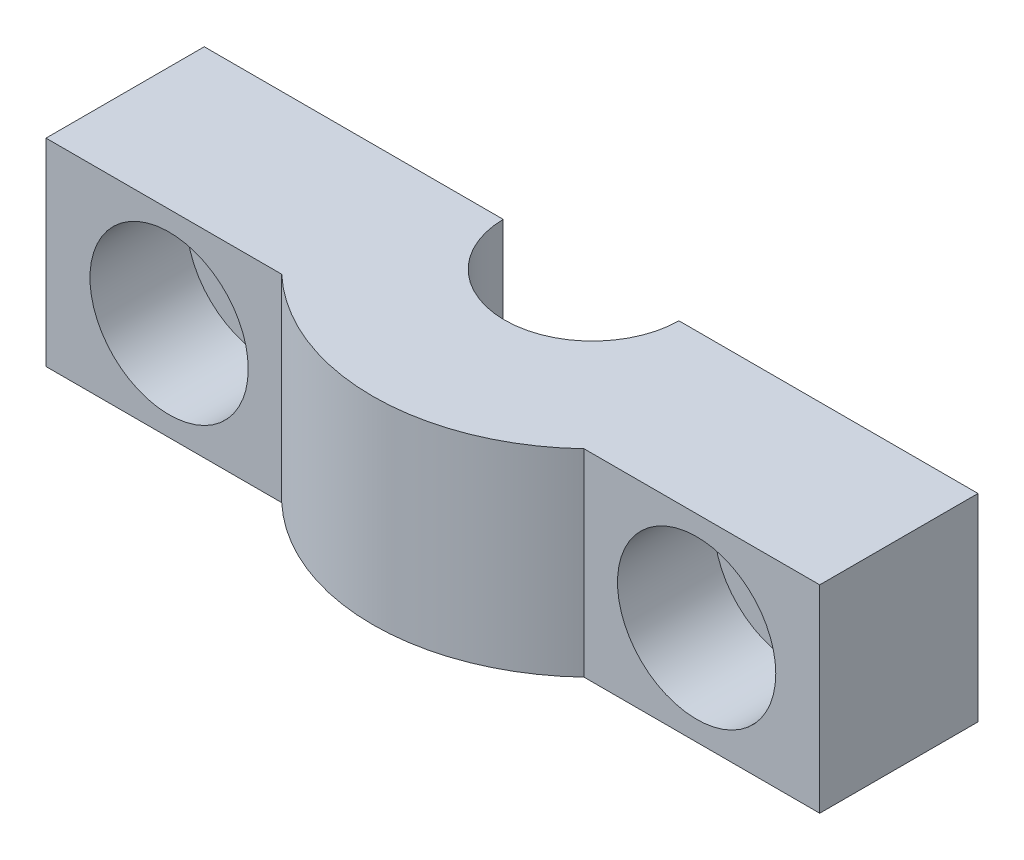
ISO-10303-21;
HEADER;
FILE_DESCRIPTION(('STEP AP214'),'2;1');
FILE_NAME('part.step','',(''),(''),'','','');
FILE_SCHEMA(('AUTOMOTIVE_DESIGN { 1 0 10303 214 1 1 1 1 }'));
ENDSEC;
DATA;
#1=APPLICATION_CONTEXT('core data for automotive mechanical design processes');
#2=APPLICATION_PROTOCOL_DEFINITION('international standard','automotive_design',2000,#1);
#3=PRODUCT_CONTEXT('',#1,'mechanical');
#4=PRODUCT('Part','Part','',(#3));
#5=PRODUCT_RELATED_PRODUCT_CATEGORY('part','',(#4));
#6=PRODUCT_DEFINITION_FORMATION('','',#4);
#7=PRODUCT_DEFINITION_CONTEXT('part definition',#1,'design');
#8=PRODUCT_DEFINITION('design','',#6,#7);
#9=PRODUCT_DEFINITION_SHAPE('','',#8);
#10=(LENGTH_UNIT() NAMED_UNIT(*) SI_UNIT(.MILLI.,.METRE.));
#11=(NAMED_UNIT(*) PLANE_ANGLE_UNIT() SI_UNIT($,.RADIAN.));
#12=(NAMED_UNIT(*) SI_UNIT($,.STERADIAN.) SOLID_ANGLE_UNIT());
#13=UNCERTAINTY_MEASURE_WITH_UNIT(LENGTH_MEASURE(1.E-05),#10,'distance_accuracy_value','');
#14=(GEOMETRIC_REPRESENTATION_CONTEXT(3) GLOBAL_UNCERTAINTY_ASSIGNED_CONTEXT((#13)) GLOBAL_UNIT_ASSIGNED_CONTEXT((#10,
#11,#12)) REPRESENTATION_CONTEXT('',''));
#15=CARTESIAN_POINT('',(0.,0.,0.));
#16=DIRECTION('',(0.,0.,1.));
#17=DIRECTION('',(1.,0.,0.));
#18=AXIS2_PLACEMENT_3D('',#15,#16,#17);
#19=CARTESIAN_POINT('',(-15.,5.625,-5.9238242869548));
#20=DIRECTION('',(0.,0.,1.));
#21=DIRECTION('',(1.,0.,0.));
#22=AXIS2_PLACEMENT_3D('',#19,#20,#21);
#23=CYLINDRICAL_SURFACE('',#22,1.75);
#24=CARTESIAN_POINT('',(-15.,5.625,0.0761757130452031));
#25=DIRECTION('',(0.,0.,1.));
#26=DIRECTION('',(1.,0.,0.));
#27=AXIS2_PLACEMENT_3D('',#24,#25,#26);
#28=CIRCLE('',#27,1.75);
#29=CARTESIAN_POINT('',(-13.25,5.625,0.0761757130452023));
#30=VERTEX_POINT('',#29);
#31=EDGE_CURVE('E161',#30,#30,#28,.T.);
#32=CARTESIAN_POINT('',(-15.,5.625,3.5761757130452));
#33=DIRECTION('',(0.,0.,1.));
#34=DIRECTION('',(1.,0.,0.));
#35=AXIS2_PLACEMENT_3D('',#32,#33,#34);
#36=CIRCLE('',#35,1.75);
#37=CARTESIAN_POINT('',(-13.25,5.625,3.5761757130452));
#38=VERTEX_POINT('',#37);
#39=EDGE_CURVE('E38',#38,#38,#36,.F.);
#40=CARTESIAN_POINT('',(-13.25,5.625,0.0761757130452023));
#41=CARTESIAN_POINT('',(-13.25,5.625,0.112634046378536));
#42=CARTESIAN_POINT('',(-13.25,5.625,0.149092379711869));
#43=CARTESIAN_POINT('',(-13.25,5.625,0.222009046378536));
#44=CARTESIAN_POINT('',(-13.25,5.625,0.258467379711869));
#45=CARTESIAN_POINT('',(-13.25,5.625,0.331384046378536));
#46=CARTESIAN_POINT('',(-13.25,5.625,0.367842379711869));
#47=CARTESIAN_POINT('',(-13.25,5.625,0.440759046378536));
#48=CARTESIAN_POINT('',(-13.25,5.625,0.477217379711869));
#49=CARTESIAN_POINT('',(-13.25,5.625,0.550134046378536));
#50=CARTESIAN_POINT('',(-13.25,5.625,0.586592379711869));
#51=CARTESIAN_POINT('',(-13.25,5.625,0.659509046378536));
#52=CARTESIAN_POINT('',(-13.25,5.625,0.69596737971187));
#53=CARTESIAN_POINT('',(-13.25,5.625,0.768884046378536));
#54=CARTESIAN_POINT('',(-13.25,5.625,0.80534237971187));
#55=CARTESIAN_POINT('',(-13.25,5.625,0.878259046378536));
#56=CARTESIAN_POINT('',(-13.25,5.625,0.91471737971187));
#57=CARTESIAN_POINT('',(-13.25,5.625,0.987634046378536));
#58=CARTESIAN_POINT('',(-13.25,5.625,1.02409237971187));
#59=CARTESIAN_POINT('',(-13.25,5.625,1.09700904637854));
#60=CARTESIAN_POINT('',(-13.25,5.625,1.13346737971187));
#61=CARTESIAN_POINT('',(-13.25,5.625,1.20638404637854));
#62=CARTESIAN_POINT('',(-13.25,5.625,1.24284237971187));
#63=CARTESIAN_POINT('',(-13.25,5.625,1.31575904637854));
#64=CARTESIAN_POINT('',(-13.25,5.625,1.35221737971187));
#65=CARTESIAN_POINT('',(-13.25,5.625,1.42513404637854));
#66=CARTESIAN_POINT('',(-13.25,5.625,1.46159237971187));
#67=CARTESIAN_POINT('',(-13.25,5.625,1.53450904637854));
#68=CARTESIAN_POINT('',(-13.25,5.625,1.57096737971187));
#69=CARTESIAN_POINT('',(-13.25,5.625,1.64388404637854));
#70=CARTESIAN_POINT('',(-13.25,5.625,1.68034237971187));
#71=CARTESIAN_POINT('',(-13.25,5.625,1.75325904637854));
#72=CARTESIAN_POINT('',(-13.25,5.625,1.78971737971187));
#73=CARTESIAN_POINT('',(-13.25,5.625,1.86263404637854));
#74=CARTESIAN_POINT('',(-13.25,5.625,1.89909237971187));
#75=CARTESIAN_POINT('',(-13.25,5.625,1.97200904637854));
#76=CARTESIAN_POINT('',(-13.25,5.625,2.00846737971187));
#77=CARTESIAN_POINT('',(-13.25,5.625,2.08138404637854));
#78=CARTESIAN_POINT('',(-13.25,5.625,2.11784237971187));
#79=CARTESIAN_POINT('',(-13.25,5.625,2.19075904637854));
#80=CARTESIAN_POINT('',(-13.25,5.625,2.22721737971187));
#81=CARTESIAN_POINT('',(-13.25,5.625,2.30013404637854));
#82=CARTESIAN_POINT('',(-13.25,5.625,2.33659237971187));
#83=CARTESIAN_POINT('',(-13.25,5.625,2.40950904637854));
#84=CARTESIAN_POINT('',(-13.25,5.625,2.44596737971187));
#85=CARTESIAN_POINT('',(-13.25,5.625,2.51888404637854));
#86=CARTESIAN_POINT('',(-13.25,5.625,2.55534237971187));
#87=CARTESIAN_POINT('',(-13.25,5.625,2.62825904637854));
#88=CARTESIAN_POINT('',(-13.25,5.625,2.66471737971187));
#89=CARTESIAN_POINT('',(-13.25,5.625,2.73763404637854));
#90=CARTESIAN_POINT('',(-13.25,5.625,2.77409237971187));
#91=CARTESIAN_POINT('',(-13.25,5.625,2.84700904637854));
#92=CARTESIAN_POINT('',(-13.25,5.625,2.88346737971187));
#93=CARTESIAN_POINT('',(-13.25,5.625,2.95638404637854));
#94=CARTESIAN_POINT('',(-13.25,5.625,2.99284237971187));
#95=CARTESIAN_POINT('',(-13.25,5.625,3.06575904637854));
#96=CARTESIAN_POINT('',(-13.25,5.625,3.10221737971187));
#97=CARTESIAN_POINT('',(-13.25,5.625,3.17513404637854));
#98=CARTESIAN_POINT('',(-13.25,5.625,3.21159237971187));
#99=CARTESIAN_POINT('',(-13.25,5.625,3.28450904637854));
#100=CARTESIAN_POINT('',(-13.25,5.625,3.32096737971187));
#101=CARTESIAN_POINT('',(-13.25,5.625,3.39388404637854));
#102=CARTESIAN_POINT('',(-13.25,5.625,3.43034237971187));
#103=CARTESIAN_POINT('',(-13.25,5.625,3.50325904637854));
#104=CARTESIAN_POINT('',(-13.25,5.625,3.53971737971187));
#105=CARTESIAN_POINT('',(-13.25,5.625,3.5761757130452));
#106=B_SPLINE_CURVE_WITH_KNOTS('',3,(#40,#41,#42,#43,#44,#45,#46,#47,#48,#49,#50,#51,#52,#53,
#54,#55,#56,#57,#58,#59,#60,#61,#62,#63,#64,#65,#66,#67,#68,#69,#70,#71,#72,#73,#74,#75,#76,#77,
#78,#79,#80,#81,#82,#83,#84,#85,#86,#87,#88,#89,#90,#91,#92,#93,#94,#95,#96,#97,#98,#99,#100,
#101,#102,#103,#104,#105),.UNSPECIFIED.,.F.,.F.,(4,2,2,2,2,2,2,2,2,2,2,2,2,2,2,2,2,2,2,2,2,2,2,
2,2,2,2,2,2,2,2,2,4),(0.,0.109375,0.21875,0.328125,0.4375,0.546875,0.656250000000001,
0.765625000000001,0.875000000000001,0.984375000000001,1.09375,1.203125,1.3125,1.421875,1.53125,
1.640625,1.75,1.859375,1.96875,2.078125,2.1875,2.296875,2.40625,2.515625,2.625,2.734375,2.84375,
2.953125,3.0625,3.171875,3.28125,3.390625,3.5),.UNSPECIFIED.);
#107=EDGE_CURVE('BSEAM34',#30,#38,#106,.T.);
#108=ORIENTED_EDGE('',*,*,#31,.F.);
#109=ORIENTED_EDGE('',*,*,#39,.F.);
#110=ORIENTED_EDGE('',*,*,#107,.T.);
#111=ORIENTED_EDGE('',*,*,#107,.F.);
#112=EDGE_LOOP('',(#108,#110,#109,#111));
#113=FACE_BOUND('',#112,.T.);
#114=ADVANCED_FACE('F34',(#113),#23,.F.);
#115=CARTESIAN_POINT('',(15.,5.625,-5.9238242869548));
#116=DIRECTION('',(0.,0.,1.));
#117=DIRECTION('',(1.,0.,0.));
#118=AXIS2_PLACEMENT_3D('',#115,#116,#117);
#119=CYLINDRICAL_SURFACE('',#118,1.75);
#120=CARTESIAN_POINT('',(15.,5.625,0.0761757130452014));
#121=DIRECTION('',(0.,0.,1.));
#122=DIRECTION('',(1.,0.,0.));
#123=AXIS2_PLACEMENT_3D('',#120,#121,#122);
#124=CIRCLE('',#123,1.75);
#125=CARTESIAN_POINT('',(16.75,5.625,0.0761757130452005));
#126=VERTEX_POINT('',#125);
#127=EDGE_CURVE('E137',#126,#126,#124,.T.);
#128=CARTESIAN_POINT('',(15.,5.625,3.5761757130452));
#129=DIRECTION('',(0.,0.,1.));
#130=DIRECTION('',(1.,0.,0.));
#131=AXIS2_PLACEMENT_3D('',#128,#129,#130);
#132=CIRCLE('',#131,1.75);
#133=CARTESIAN_POINT('',(16.75,5.625,3.5761757130452));
#134=VERTEX_POINT('',#133);
#135=EDGE_CURVE('E162',#134,#134,#132,.F.);
#136=CARTESIAN_POINT('',(16.75,5.625,0.0761757130452005));
#137=CARTESIAN_POINT('',(16.75,5.625,0.112634046378534));
#138=CARTESIAN_POINT('',(16.75,5.625,0.149092379711867));
#139=CARTESIAN_POINT('',(16.75,5.625,0.222009046378534));
#140=CARTESIAN_POINT('',(16.75,5.625,0.258467379711867));
#141=CARTESIAN_POINT('',(16.75,5.625,0.331384046378534));
#142=CARTESIAN_POINT('',(16.75,5.625,0.367842379711867));
#143=CARTESIAN_POINT('',(16.75,5.625,0.440759046378534));
#144=CARTESIAN_POINT('',(16.75,5.625,0.477217379711868));
#145=CARTESIAN_POINT('',(16.75,5.625,0.550134046378534));
#146=CARTESIAN_POINT('',(16.75,5.625,0.586592379711867));
#147=CARTESIAN_POINT('',(16.75,5.625,0.659509046378533));
#148=CARTESIAN_POINT('',(16.75,5.625,0.695967379711867));
#149=CARTESIAN_POINT('',(16.75,5.625,0.768884046378534));
#150=CARTESIAN_POINT('',(16.75,5.625,0.805342379711867));
#151=CARTESIAN_POINT('',(16.75,5.625,0.878259046378534));
#152=CARTESIAN_POINT('',(16.75,5.625,0.914717379711867));
#153=CARTESIAN_POINT('',(16.75,5.625,0.987634046378534));
#154=CARTESIAN_POINT('',(16.75,5.625,1.02409237971187));
#155=CARTESIAN_POINT('',(16.75,5.625,1.09700904637853));
#156=CARTESIAN_POINT('',(16.75,5.625,1.13346737971187));
#157=CARTESIAN_POINT('',(16.75,5.625,1.20638404637853));
#158=CARTESIAN_POINT('',(16.75,5.625,1.24284237971187));
#159=CARTESIAN_POINT('',(16.75,5.625,1.31575904637853));
#160=CARTESIAN_POINT('',(16.75,5.625,1.35221737971187));
#161=CARTESIAN_POINT('',(16.75,5.625,1.42513404637853));
#162=CARTESIAN_POINT('',(16.75,5.625,1.46159237971187));
#163=CARTESIAN_POINT('',(16.75,5.625,1.53450904637853));
#164=CARTESIAN_POINT('',(16.75,5.625,1.57096737971187));
#165=CARTESIAN_POINT('',(16.75,5.625,1.64388404637853));
#166=CARTESIAN_POINT('',(16.75,5.625,1.68034237971187));
#167=CARTESIAN_POINT('',(16.75,5.625,1.75325904637853));
#168=CARTESIAN_POINT('',(16.75,5.625,1.78971737971187));
#169=CARTESIAN_POINT('',(16.75,5.625,1.86263404637853));
#170=CARTESIAN_POINT('',(16.75,5.625,1.89909237971187));
#171=CARTESIAN_POINT('',(16.75,5.625,1.97200904637853));
#172=CARTESIAN_POINT('',(16.75,5.625,2.00846737971187));
#173=CARTESIAN_POINT('',(16.75,5.625,2.08138404637853));
#174=CARTESIAN_POINT('',(16.75,5.625,2.11784237971187));
#175=CARTESIAN_POINT('',(16.75,5.625,2.19075904637853));
#176=CARTESIAN_POINT('',(16.75,5.625,2.22721737971187));
#177=CARTESIAN_POINT('',(16.75,5.625,2.30013404637853));
#178=CARTESIAN_POINT('',(16.75,5.625,2.33659237971187));
#179=CARTESIAN_POINT('',(16.75,5.625,2.40950904637853));
#180=CARTESIAN_POINT('',(16.75,5.625,2.44596737971187));
#181=CARTESIAN_POINT('',(16.75,5.625,2.51888404637853));
#182=CARTESIAN_POINT('',(16.75,5.625,2.55534237971187));
#183=CARTESIAN_POINT('',(16.75,5.625,2.62825904637853));
#184=CARTESIAN_POINT('',(16.75,5.625,2.66471737971187));
#185=CARTESIAN_POINT('',(16.75,5.625,2.73763404637853));
#186=CARTESIAN_POINT('',(16.75,5.625,2.77409237971187));
#187=CARTESIAN_POINT('',(16.75,5.625,2.84700904637853));
#188=CARTESIAN_POINT('',(16.75,5.625,2.88346737971187));
#189=CARTESIAN_POINT('',(16.75,5.625,2.95638404637853));
#190=CARTESIAN_POINT('',(16.75,5.625,2.99284237971187));
#191=CARTESIAN_POINT('',(16.75,5.625,3.06575904637853));
#192=CARTESIAN_POINT('',(16.75,5.625,3.10221737971187));
#193=CARTESIAN_POINT('',(16.75,5.625,3.17513404637853));
#194=CARTESIAN_POINT('',(16.75,5.625,3.21159237971187));
#195=CARTESIAN_POINT('',(16.75,5.625,3.28450904637853));
#196=CARTESIAN_POINT('',(16.75,5.625,3.32096737971187));
#197=CARTESIAN_POINT('',(16.75,5.625,3.39388404637853));
#198=CARTESIAN_POINT('',(16.75,5.625,3.43034237971187));
#199=CARTESIAN_POINT('',(16.75,5.625,3.50325904637853));
#200=CARTESIAN_POINT('',(16.75,5.625,3.53971737971187));
#201=CARTESIAN_POINT('',(16.75,5.625,3.5761757130452));
#202=B_SPLINE_CURVE_WITH_KNOTS('',3,(#136,#137,#138,#139,#140,#141,#142,#143,#144,#145,#146,
#147,#148,#149,#150,#151,#152,#153,#154,#155,#156,#157,#158,#159,#160,#161,#162,#163,#164,#165,
#166,#167,#168,#169,#170,#171,#172,#173,#174,#175,#176,#177,#178,#179,#180,#181,#182,#183,#184,
#185,#186,#187,#188,#189,#190,#191,#192,#193,#194,#195,#196,#197,#198,#199,#200,#201),
.UNSPECIFIED.,.F.,.F.,(4,2,2,2,2,2,2,2,2,2,2,2,2,2,2,2,2,2,2,2,2,2,2,2,2,2,2,2,2,2,2,2,4),(0.,
0.109375,0.21875,0.328125,0.4375,0.546875,0.65625,0.765625,0.875,0.984375,1.09375,1.203125,
1.3125,1.421875,1.53125,1.640625,1.75,1.859375,1.96875,2.078125,2.1875,2.296875,2.40625,
2.515625,2.625,2.734375,2.84375,2.953125,3.0625,3.171875,3.28125,3.390625,3.5),.UNSPECIFIED.);
#203=EDGE_CURVE('BSEAM212',#126,#134,#202,.T.);
#204=ORIENTED_EDGE('',*,*,#127,.F.);
#205=ORIENTED_EDGE('',*,*,#135,.F.);
#206=ORIENTED_EDGE('',*,*,#203,.T.);
#207=ORIENTED_EDGE('',*,*,#203,.F.);
#208=EDGE_LOOP('',(#204,#206,#205,#207));
#209=FACE_BOUND('',#208,.T.);
#210=ADVANCED_FACE('F212',(#209),#119,.F.);
#211=CARTESIAN_POINT('',(0.,11.25,0.));
#212=DIRECTION('',(0.,-1.,0.));
#213=DIRECTION('',(0.,0.,-1.));
#214=AXIS2_PLACEMENT_3D('',#211,#212,#213);
#215=CYLINDRICAL_SURFACE('',#214,5.);
#216=CARTESIAN_POINT('',(0.,0.,0.));
#217=DIRECTION('',(0.,-1.,0.));
#218=DIRECTION('',(0.,0.,1.));
#219=AXIS2_PLACEMENT_3D('',#216,#217,#218);
#220=CIRCLE('',#219,5.);
#221=CARTESIAN_POINT('',(4.99941969239851,0.,0.0761757130452018));
#222=VERTEX_POINT('',#221);
#223=CARTESIAN_POINT('',(-4.99941969239851,0.,0.0761757130452018));
#224=VERTEX_POINT('',#223);
#225=EDGE_CURVE('E133',#222,#224,#220,.T.);
#226=ORIENTED_EDGE('',*,*,#225,.T.);
#227=DIRECTION('',(0.,-1.,0.));
#228=VECTOR('',#227,1.);
#229=CARTESIAN_POINT('',(-4.99941969239851,11.25,0.0761757130452018));
#230=LINE('',#229,#228);
#231=CARTESIAN_POINT('',(-4.99941969239851,11.25,0.0761757130452018));
#232=VERTEX_POINT('',#231);
#233=EDGE_CURVE('E12',#232,#224,#230,.T.);
#234=ORIENTED_EDGE('',*,*,#233,.F.);
#235=CARTESIAN_POINT('',(0.,11.25,0.));
#236=DIRECTION('',(0.,-1.,0.));
#237=DIRECTION('',(0.,0.,1.));
#238=AXIS2_PLACEMENT_3D('',#235,#236,#237);
#239=CIRCLE('',#238,5.);
#240=CARTESIAN_POINT('',(4.99941969239851,11.25,0.0761757130452018));
#241=VERTEX_POINT('',#240);
#242=EDGE_CURVE('E148',#241,#232,#239,.T.);
#243=ORIENTED_EDGE('',*,*,#242,.F.);
#244=DIRECTION('',(0.,-1.,0.));
#245=VECTOR('',#244,1.);
#246=CARTESIAN_POINT('',(4.99941969239851,11.25,0.0761757130452018));
#247=LINE('',#246,#245);
#248=EDGE_CURVE('E129',#241,#222,#247,.T.);
#249=ORIENTED_EDGE('',*,*,#248,.T.);
#250=EDGE_LOOP('',(#226,#234,#243,#249));
#251=FACE_BOUND('',#250,.T.);
#252=ADVANCED_FACE('F36',(#251),#215,.F.);
#253=CARTESIAN_POINT('',(-4.99941969239851,11.25,0.0761757130452018));
#254=DIRECTION('',(0.,0.,1.));
#255=DIRECTION('',(1.,0.,0.));
#256=AXIS2_PLACEMENT_3D('',#253,#254,#255);
#257=PLANE('',#256);
#258=ORIENTED_EDGE('',*,*,#31,.T.);
#259=EDGE_LOOP('',(#258));
#260=FACE_BOUND('',#259,.T.);
#261=DIRECTION('',(-1.,0.,0.));
#262=VECTOR('',#261,1.);
#263=CARTESIAN_POINT('',(-4.99941969239851,0.,0.0761757130452018));
#264=LINE('',#263,#262);
#265=CARTESIAN_POINT('',(-21.999868119167,0.,0.076175713045203));
#266=VERTEX_POINT('',#265);
#267=EDGE_CURVE('E136',#224,#266,#264,.T.);
#268=ORIENTED_EDGE('',*,*,#267,.T.);
#269=DIRECTION('',(0.,-1.,0.));
#270=VECTOR('',#269,1.);
#271=CARTESIAN_POINT('',(-21.999868119167,11.25,0.076175713045203));
#272=LINE('',#271,#270);
#273=CARTESIAN_POINT('',(-21.999868119167,11.25,0.076175713045203));
#274=VERTEX_POINT('',#273);
#275=EDGE_CURVE('E44',#274,#266,#272,.T.);
#276=ORIENTED_EDGE('',*,*,#275,.F.);
#277=DIRECTION('',(-1.,0.,0.));
#278=VECTOR('',#277,1.);
#279=CARTESIAN_POINT('',(-4.99941969239851,11.25,0.0761757130452018));
#280=LINE('',#279,#278);
#281=EDGE_CURVE('E96',#232,#274,#280,.T.);
#282=ORIENTED_EDGE('',*,*,#281,.F.);
#283=ORIENTED_EDGE('',*,*,#233,.T.);
#284=EDGE_LOOP('',(#268,#276,#282,#283));
#285=FACE_BOUND('',#284,.T.);
#286=ADVANCED_FACE('F264',(#260,#285),#257,.F.);
#287=CARTESIAN_POINT('',(-21.999868119167,11.25,0.076175713045203));
#288=DIRECTION('',(1.,0.,0.));
#289=DIRECTION('',(0.,0.,-1.));
#290=AXIS2_PLACEMENT_3D('',#287,#288,#289);
#291=PLANE('',#290);
#292=DIRECTION('',(0.,0.,1.));
#293=VECTOR('',#292,1.);
#294=CARTESIAN_POINT('',(-21.999868119167,0.,0.076175713045203));
#295=LINE('',#294,#293);
#296=CARTESIAN_POINT('',(-21.999868119167,0.,9.0761757130452));
#297=VERTEX_POINT('',#296);
#298=EDGE_CURVE('E139',#266,#297,#295,.T.);
#299=ORIENTED_EDGE('',*,*,#298,.T.);
#300=DIRECTION('',(0.,-1.,0.));
#301=VECTOR('',#300,1.);
#302=CARTESIAN_POINT('',(-21.999868119167,11.25,9.0761757130452));
#303=LINE('',#302,#301);
#304=CARTESIAN_POINT('',(-21.999868119167,11.25,9.0761757130452));
#305=VERTEX_POINT('',#304);
#306=EDGE_CURVE('E155',#305,#297,#303,.T.);
#307=ORIENTED_EDGE('',*,*,#306,.F.);
#308=DIRECTION('',(0.,0.,1.));
#309=VECTOR('',#308,1.);
#310=CARTESIAN_POINT('',(-21.999868119167,11.25,0.076175713045203));
#311=LINE('',#310,#309);
#312=EDGE_CURVE('E180',#274,#305,#311,.T.);
#313=ORIENTED_EDGE('',*,*,#312,.F.);
#314=ORIENTED_EDGE('',*,*,#275,.T.);
#315=EDGE_LOOP('',(#299,#307,#313,#314));
#316=FACE_BOUND('',#315,.T.);
#317=ADVANCED_FACE('F257',(#316),#291,.F.);
#318=CARTESIAN_POINT('',(-21.999868119167,11.25,9.0761757130452));
#319=DIRECTION('',(0.,0.,-1.));
#320=DIRECTION('',(-1.,0.,0.));
#321=AXIS2_PLACEMENT_3D('',#318,#319,#320);
#322=PLANE('',#321);
#323=CARTESIAN_POINT('',(-15.,5.625,9.0761757130452));
#324=DIRECTION('',(0.,0.,1.));
#325=DIRECTION('',(1.,0.,0.));
#326=AXIS2_PLACEMENT_3D('',#323,#324,#325);
#327=CIRCLE('',#326,4.5);
#328=CARTESIAN_POINT('',(-10.5,5.625,9.0761757130452));
#329=VERTEX_POINT('',#328);
#330=EDGE_CURVE('E250',#329,#329,#327,.T.);
#331=ORIENTED_EDGE('',*,*,#330,.F.);
#332=EDGE_LOOP('',(#331));
#333=FACE_BOUND('',#332,.T.);
#334=DIRECTION('',(1.,0.,0.));
#335=VECTOR('',#334,1.);
#336=CARTESIAN_POINT('',(-21.999868119167,0.,9.0761757130452));
#337=LINE('',#336,#335);
#338=CARTESIAN_POINT('',(-8.59494237478813,0.,9.0761757130452));
#339=VERTEX_POINT('',#338);
#340=EDGE_CURVE('E141',#297,#339,#337,.T.);
#341=ORIENTED_EDGE('',*,*,#340,.T.);
#342=DIRECTION('',(0.,-1.,0.));
#343=VECTOR('',#342,1.);
#344=CARTESIAN_POINT('',(-8.59494237478813,11.25,9.0761757130452));
#345=LINE('',#344,#343);
#346=CARTESIAN_POINT('',(-8.59494237478813,11.25,9.0761757130452));
#347=VERTEX_POINT('',#346);
#348=EDGE_CURVE('E152',#347,#339,#345,.T.);
#349=ORIENTED_EDGE('',*,*,#348,.F.);
#350=DIRECTION('',(1.,0.,0.));
#351=VECTOR('',#350,1.);
#352=CARTESIAN_POINT('',(-21.999868119167,11.25,9.0761757130452));
#353=LINE('',#352,#351);
#354=EDGE_CURVE('E182',#305,#347,#353,.T.);
#355=ORIENTED_EDGE('',*,*,#354,.F.);
#356=ORIENTED_EDGE('',*,*,#306,.T.);
#357=EDGE_LOOP('',(#341,#349,#355,#356));
#358=FACE_BOUND('',#357,.T.);
#359=ADVANCED_FACE('F188',(#333,#358),#322,.F.);
#360=CARTESIAN_POINT('',(0.,11.25,0.));
#361=DIRECTION('',(0.,-1.,0.));
#362=DIRECTION('',(0.,0.,-1.));
#363=AXIS2_PLACEMENT_3D('',#360,#361,#362);
#364=CYLINDRICAL_SURFACE('',#363,12.5);
#365=CARTESIAN_POINT('',(0.,0.,0.));
#366=DIRECTION('',(0.,1.,0.));
#367=DIRECTION('',(0.,0.,1.));
#368=AXIS2_PLACEMENT_3D('',#365,#366,#367);
#369=CIRCLE('',#368,12.5);
#370=CARTESIAN_POINT('',(8.59494237478812,0.,9.0761757130452));
#371=VERTEX_POINT('',#370);
#372=EDGE_CURVE('E143',#339,#371,#369,.T.);
#373=ORIENTED_EDGE('',*,*,#372,.T.);
#374=DIRECTION('',(0.,-1.,0.));
#375=VECTOR('',#374,1.);
#376=CARTESIAN_POINT('',(8.59494237478812,11.25,9.0761757130452));
#377=LINE('',#376,#375);
#378=CARTESIAN_POINT('',(8.59494237478812,11.25,9.0761757130452));
#379=VERTEX_POINT('',#378);
#380=EDGE_CURVE('E124',#379,#371,#377,.T.);
#381=ORIENTED_EDGE('',*,*,#380,.F.);
#382=CARTESIAN_POINT('',(0.,11.25,0.));
#383=DIRECTION('',(0.,1.,0.));
#384=DIRECTION('',(0.,0.,1.));
#385=AXIS2_PLACEMENT_3D('',#382,#383,#384);
#386=CIRCLE('',#385,12.5);
#387=EDGE_CURVE('E115',#347,#379,#386,.T.);
#388=ORIENTED_EDGE('',*,*,#387,.F.);
#389=ORIENTED_EDGE('',*,*,#348,.T.);
#390=EDGE_LOOP('',(#373,#381,#388,#389));
#391=FACE_BOUND('',#390,.T.);
#392=ADVANCED_FACE('F192',(#391),#364,.T.);
#393=CARTESIAN_POINT('',(21.999868119167,11.25,9.0761757130452));
#394=DIRECTION('',(0.,0.,-1.));
#395=DIRECTION('',(-1.,0.,0.));
#396=AXIS2_PLACEMENT_3D('',#393,#394,#395);
#397=PLANE('',#396);
#398=CARTESIAN_POINT('',(15.,5.625,9.0761757130452));
#399=DIRECTION('',(0.,0.,1.));
#400=DIRECTION('',(1.,0.,0.));
#401=AXIS2_PLACEMENT_3D('',#398,#399,#400);
#402=CIRCLE('',#401,4.5);
#403=CARTESIAN_POINT('',(19.5,5.625,9.0761757130452));
#404=VERTEX_POINT('',#403);
#405=EDGE_CURVE('E170',#404,#404,#402,.T.);
#406=ORIENTED_EDGE('',*,*,#405,.F.);
#407=EDGE_LOOP('',(#406));
#408=FACE_BOUND('',#407,.T.);
#409=DIRECTION('',(1.,0.,0.));
#410=VECTOR('',#409,1.);
#411=CARTESIAN_POINT('',(21.999868119167,0.,9.0761757130452));
#412=LINE('',#411,#410);
#413=CARTESIAN_POINT('',(21.999868119167,0.,9.0761757130452));
#414=VERTEX_POINT('',#413);
#415=EDGE_CURVE('E123',#371,#414,#412,.T.);
#416=ORIENTED_EDGE('',*,*,#415,.T.);
#417=DIRECTION('',(0.,-1.,0.));
#418=VECTOR('',#417,1.);
#419=CARTESIAN_POINT('',(21.999868119167,11.25,9.0761757130452));
#420=LINE('',#419,#418);
#421=CARTESIAN_POINT('',(21.999868119167,11.25,9.0761757130452));
#422=VERTEX_POINT('',#421);
#423=EDGE_CURVE('E120',#422,#414,#420,.T.);
#424=ORIENTED_EDGE('',*,*,#423,.F.);
#425=DIRECTION('',(1.,0.,0.));
#426=VECTOR('',#425,1.);
#427=CARTESIAN_POINT('',(21.999868119167,11.25,9.0761757130452));
#428=LINE('',#427,#426);
#429=EDGE_CURVE('E109',#379,#422,#428,.T.);
#430=ORIENTED_EDGE('',*,*,#429,.F.);
#431=ORIENTED_EDGE('',*,*,#380,.T.);
#432=EDGE_LOOP('',(#416,#424,#430,#431));
#433=FACE_BOUND('',#432,.T.);
#434=ADVANCED_FACE('F121',(#408,#433),#397,.F.);
#435=CARTESIAN_POINT('',(21.999868119167,11.25,0.0761757130452006));
#436=DIRECTION('',(-1.,0.,0.));
#437=DIRECTION('',(0.,0.,1.));
#438=AXIS2_PLACEMENT_3D('',#435,#436,#437);
#439=PLANE('',#438);
#440=DIRECTION('',(0.,0.,-1.));
#441=VECTOR('',#440,1.);
#442=CARTESIAN_POINT('',(21.999868119167,0.,0.0761757130452006));
#443=LINE('',#442,#441);
#444=CARTESIAN_POINT('',(21.999868119167,0.,0.0761757130452006));
#445=VERTEX_POINT('',#444);
#446=EDGE_CURVE('E82',#414,#445,#443,.T.);
#447=ORIENTED_EDGE('',*,*,#446,.T.);
#448=DIRECTION('',(0.,-1.,0.));
#449=VECTOR('',#448,1.);
#450=CARTESIAN_POINT('',(21.999868119167,11.25,0.0761757130452006));
#451=LINE('',#450,#449);
#452=CARTESIAN_POINT('',(21.999868119167,11.25,0.0761757130452006));
#453=VERTEX_POINT('',#452);
#454=EDGE_CURVE('E125',#453,#445,#451,.T.);
#455=ORIENTED_EDGE('',*,*,#454,.F.);
#456=DIRECTION('',(0.,0.,-1.));
#457=VECTOR('',#456,1.);
#458=CARTESIAN_POINT('',(21.999868119167,11.25,0.0761757130452006));
#459=LINE('',#458,#457);
#460=EDGE_CURVE('E113',#422,#453,#459,.T.);
#461=ORIENTED_EDGE('',*,*,#460,.F.);
#462=ORIENTED_EDGE('',*,*,#423,.T.);
#463=EDGE_LOOP('',(#447,#455,#461,#462));
#464=FACE_BOUND('',#463,.T.);
#465=ADVANCED_FACE('F127',(#464),#439,.F.);
#466=CARTESIAN_POINT('',(4.99941969239851,11.25,0.0761757130452018));
#467=DIRECTION('',(0.,0.,1.));
#468=DIRECTION('',(1.,0.,0.));
#469=AXIS2_PLACEMENT_3D('',#466,#467,#468);
#470=PLANE('',#469);
#471=ORIENTED_EDGE('',*,*,#127,.T.);
#472=EDGE_LOOP('',(#471));
#473=FACE_BOUND('',#472,.T.);
#474=DIRECTION('',(-1.,0.,0.));
#475=VECTOR('',#474,1.);
#476=CARTESIAN_POINT('',(4.99941969239851,0.,0.0761757130452018));
#477=LINE('',#476,#475);
#478=EDGE_CURVE('E88',#445,#222,#477,.T.);
#479=ORIENTED_EDGE('',*,*,#478,.T.);
#480=ORIENTED_EDGE('',*,*,#248,.F.);
#481=DIRECTION('',(-1.,0.,0.));
#482=VECTOR('',#481,1.);
#483=CARTESIAN_POINT('',(4.99941969239851,11.25,0.0761757130452018));
#484=LINE('',#483,#482);
#485=EDGE_CURVE('E53',#453,#241,#484,.T.);
#486=ORIENTED_EDGE('',*,*,#485,.F.);
#487=ORIENTED_EDGE('',*,*,#454,.T.);
#488=EDGE_LOOP('',(#479,#480,#486,#487));
#489=FACE_BOUND('',#488,.T.);
#490=ADVANCED_FACE('F200',(#473,#489),#470,.F.);
#491=CARTESIAN_POINT('',(0.,11.25,0.));
#492=DIRECTION('',(0.,1.,0.));
#493=DIRECTION('',(0.,0.,1.));
#494=AXIS2_PLACEMENT_3D('',#491,#492,#493);
#495=PLANE('',#494);
#496=ORIENTED_EDGE('',*,*,#242,.T.);
#497=ORIENTED_EDGE('',*,*,#281,.T.);
#498=ORIENTED_EDGE('',*,*,#312,.T.);
#499=ORIENTED_EDGE('',*,*,#354,.T.);
#500=ORIENTED_EDGE('',*,*,#387,.T.);
#501=ORIENTED_EDGE('',*,*,#429,.T.);
#502=ORIENTED_EDGE('',*,*,#460,.T.);
#503=ORIENTED_EDGE('',*,*,#485,.T.);
#504=EDGE_LOOP('',(#496,#497,#498,#499,#500,#501,#502,#503));
#505=FACE_BOUND('',#504,.T.);
#506=ADVANCED_FACE('F111',(#505),#495,.T.);
#507=CARTESIAN_POINT('',(0.,0.,0.));
#508=DIRECTION('',(0.,1.,0.));
#509=DIRECTION('',(0.,0.,1.));
#510=AXIS2_PLACEMENT_3D('',#507,#508,#509);
#511=PLANE('',#510);
#512=ORIENTED_EDGE('',*,*,#225,.F.);
#513=ORIENTED_EDGE('',*,*,#478,.F.);
#514=ORIENTED_EDGE('',*,*,#446,.F.);
#515=ORIENTED_EDGE('',*,*,#415,.F.);
#516=ORIENTED_EDGE('',*,*,#372,.F.);
#517=ORIENTED_EDGE('',*,*,#340,.F.);
#518=ORIENTED_EDGE('',*,*,#298,.F.);
#519=ORIENTED_EDGE('',*,*,#267,.F.);
#520=EDGE_LOOP('',(#512,#513,#514,#515,#516,#517,#518,#519));
#521=FACE_BOUND('',#520,.T.);
#522=ADVANCED_FACE('F195',(#521),#511,.F.);
#523=CARTESIAN_POINT('',(4.99941969239851,11.25,3.5761757130452));
#524=DIRECTION('',(0.,0.,1.));
#525=DIRECTION('',(1.,0.,0.));
#526=AXIS2_PLACEMENT_3D('',#523,#524,#525);
#527=PLANE('',#526);
#528=CARTESIAN_POINT('',(15.,5.625,3.5761757130452));
#529=DIRECTION('',(0.,0.,1.));
#530=DIRECTION('',(1.,0.,0.));
#531=AXIS2_PLACEMENT_3D('',#528,#529,#530);
#532=CIRCLE('',#531,4.5);
#533=CARTESIAN_POINT('',(19.5,5.625,3.5761757130452));
#534=VERTEX_POINT('',#533);
#535=EDGE_CURVE('E164',#534,#534,#532,.F.);
#536=ORIENTED_EDGE('',*,*,#535,.F.);
#537=EDGE_LOOP('',(#536));
#538=FACE_BOUND('',#537,.T.);
#539=ORIENTED_EDGE('',*,*,#135,.T.);
#540=EDGE_LOOP('',(#539));
#541=FACE_BOUND('',#540,.T.);
#542=ADVANCED_FACE('F226',(#538,#541),#527,.T.);
#543=CARTESIAN_POINT('',(15.,5.625,-12.6517463483127));
#544=DIRECTION('',(0.,0.,1.));
#545=DIRECTION('',(1.,0.,0.));
#546=AXIS2_PLACEMENT_3D('',#543,#544,#545);
#547=CYLINDRICAL_SURFACE('',#546,4.5);
#548=ORIENTED_EDGE('',*,*,#535,.T.);
#549=EDGE_LOOP('',(#548));
#550=FACE_BOUND('',#549,.T.);
#551=ORIENTED_EDGE('',*,*,#405,.T.);
#552=EDGE_LOOP('',(#551));
#553=FACE_BOUND('',#552,.T.);
#554=ADVANCED_FACE('F223',(#550,#553),#547,.F.);
#555=CARTESIAN_POINT('',(4.99941969239851,11.25,3.5761757130452));
#556=DIRECTION('',(0.,0.,1.));
#557=DIRECTION('',(1.,0.,0.));
#558=AXIS2_PLACEMENT_3D('',#555,#556,#557);
#559=PLANE('',#558);
#560=CARTESIAN_POINT('',(-15.,5.625,3.5761757130452));
#561=DIRECTION('',(0.,0.,1.));
#562=DIRECTION('',(1.,0.,0.));
#563=AXIS2_PLACEMENT_3D('',#560,#561,#562);
#564=CIRCLE('',#563,4.5);
#565=CARTESIAN_POINT('',(-10.5,5.625,3.5761757130452));
#566=VERTEX_POINT('',#565);
#567=EDGE_CURVE('E247',#566,#566,#564,.F.);
#568=ORIENTED_EDGE('',*,*,#567,.F.);
#569=EDGE_LOOP('',(#568));
#570=FACE_BOUND('',#569,.T.);
#571=ORIENTED_EDGE('',*,*,#39,.T.);
#572=EDGE_LOOP('',(#571));
#573=FACE_BOUND('',#572,.T.);
#574=ADVANCED_FACE('F234',(#570,#573),#559,.T.);
#575=CARTESIAN_POINT('',(-15.,5.625,-12.6517463483127));
#576=DIRECTION('',(0.,0.,1.));
#577=DIRECTION('',(1.,0.,0.));
#578=AXIS2_PLACEMENT_3D('',#575,#576,#577);
#579=CYLINDRICAL_SURFACE('',#578,4.5);
#580=ORIENTED_EDGE('',*,*,#567,.T.);
#581=EDGE_LOOP('',(#580));
#582=FACE_BOUND('',#581,.T.);
#583=ORIENTED_EDGE('',*,*,#330,.T.);
#584=EDGE_LOOP('',(#583));
#585=FACE_BOUND('',#584,.T.);
#586=ADVANCED_FACE('F236',(#582,#585),#579,.F.);
#587=CLOSED_SHELL('',(#114,#210,#252,#286,#317,#359,#392,#434,#465,#490,#506,#522,#542,#554,
#574,#586));
#588=MANIFOLD_SOLID_BREP('B2',#587);
#589=ADVANCED_BREP_SHAPE_REPRESENTATION('',(#18,#588),#14);
#590=SHAPE_DEFINITION_REPRESENTATION(#9,#589);
ENDSEC;
END-ISO-10303-21;
